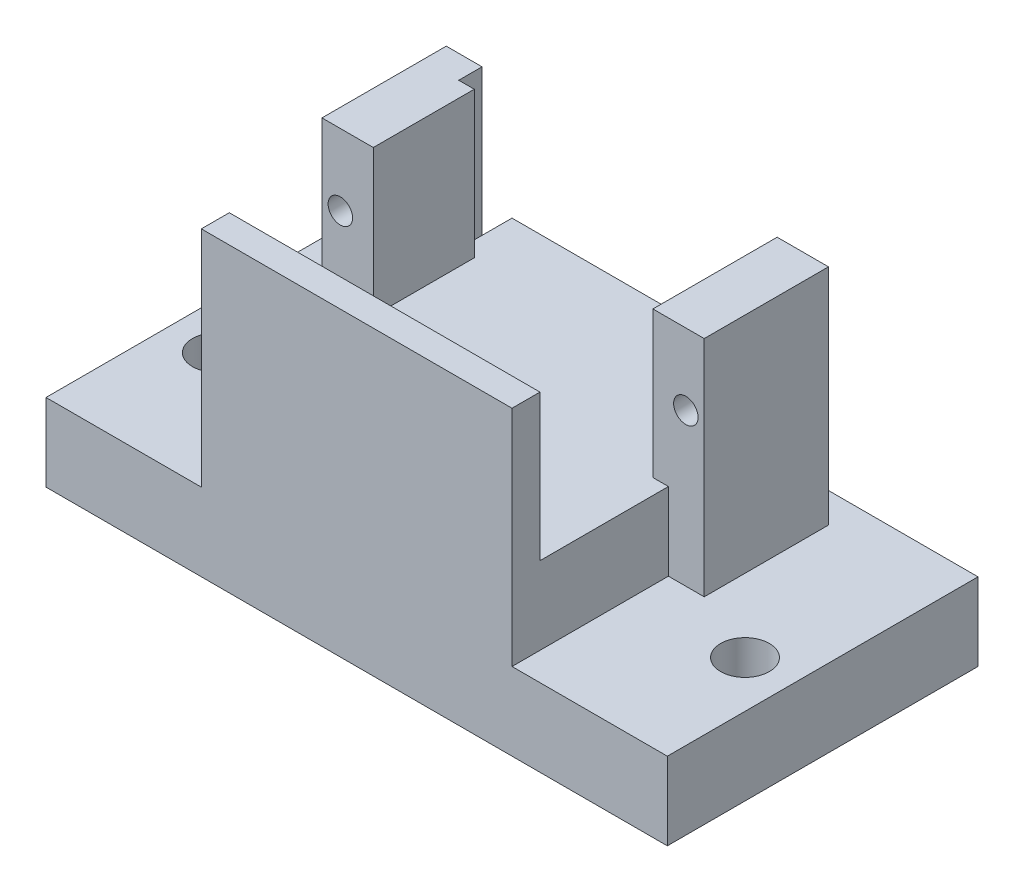
ISO-10303-21;
HEADER;
FILE_DESCRIPTION(('STEP AP214'),'2;1');
FILE_NAME('part.step','',(''),(''),'','','');
FILE_SCHEMA(('AUTOMOTIVE_DESIGN { 1 0 10303 214 1 1 1 1 }'));
ENDSEC;
DATA;
#1=APPLICATION_CONTEXT('core data for automotive mechanical design processes');
#2=APPLICATION_PROTOCOL_DEFINITION('international standard','automotive_design',2000,#1);
#3=PRODUCT_CONTEXT('',#1,'mechanical');
#4=PRODUCT('Part','Part','',(#3));
#5=PRODUCT_RELATED_PRODUCT_CATEGORY('part','',(#4));
#6=PRODUCT_DEFINITION_FORMATION('','',#4);
#7=PRODUCT_DEFINITION_CONTEXT('part definition',#1,'design');
#8=PRODUCT_DEFINITION('design','',#6,#7);
#9=PRODUCT_DEFINITION_SHAPE('','',#8);
#10=(LENGTH_UNIT() NAMED_UNIT(*) SI_UNIT(.MILLI.,.METRE.));
#11=(NAMED_UNIT(*) PLANE_ANGLE_UNIT() SI_UNIT($,.RADIAN.));
#12=(NAMED_UNIT(*) SI_UNIT($,.STERADIAN.) SOLID_ANGLE_UNIT());
#13=UNCERTAINTY_MEASURE_WITH_UNIT(LENGTH_MEASURE(1.E-05),#10,'distance_accuracy_value','');
#14=(GEOMETRIC_REPRESENTATION_CONTEXT(3) GLOBAL_UNCERTAINTY_ASSIGNED_CONTEXT((#13)) GLOBAL_UNIT_ASSIGNED_CONTEXT((#10,
#11,#12)) REPRESENTATION_CONTEXT('',''));
#15=CARTESIAN_POINT('',(0.,0.,0.));
#16=DIRECTION('',(0.,0.,1.));
#17=DIRECTION('',(1.,0.,0.));
#18=AXIS2_PLACEMENT_3D('',#15,#16,#17);
#19=CARTESIAN_POINT('',(0.,0.,0.));
#20=DIRECTION('',(0.,-1.,0.));
#21=DIRECTION('',(0.,0.,-1.));
#22=AXIS2_PLACEMENT_3D('',#19,#20,#21);
#23=PLANE('',#22);
#24=CARTESIAN_POINT('',(-21.59,0.,2.54));
#25=DIRECTION('',(0.,1.,0.));
#26=DIRECTION('',(0.,0.,1.));
#27=AXIS2_PLACEMENT_3D('',#24,#25,#26);
#28=CIRCLE('',#27,1.9939);
#29=CARTESIAN_POINT('',(-21.59,0.,4.5339));
#30=VERTEX_POINT('',#29);
#31=EDGE_CURVE('E553',#30,#30,#28,.F.);
#32=ORIENTED_EDGE('',*,*,#31,.F.);
#33=EDGE_LOOP('',(#32));
#34=FACE_BOUND('',#33,.T.);
#35=DIRECTION('',(-1.,0.,0.));
#36=VECTOR('',#35,1.);
#37=CARTESIAN_POINT('',(-12.7,0.,-12.7));
#38=LINE('',#37,#36);
#39=CARTESIAN_POINT('',(25.4,0.,-12.7));
#40=VERTEX_POINT('',#39);
#41=CARTESIAN_POINT('',(-25.4,0.,-12.7));
#42=VERTEX_POINT('',#41);
#43=EDGE_CURVE('E363',#40,#42,#38,.T.);
#44=ORIENTED_EDGE('',*,*,#43,.F.);
#45=DIRECTION('',(0.,0.,1.));
#46=VECTOR('',#45,1.);
#47=CARTESIAN_POINT('',(25.4,0.,-12.7));
#48=LINE('',#47,#46);
#49=CARTESIAN_POINT('',(25.4,0.,12.7));
#50=VERTEX_POINT('',#49);
#51=EDGE_CURVE('E335',#40,#50,#48,.T.);
#52=ORIENTED_EDGE('',*,*,#51,.T.);
#53=DIRECTION('',(1.,0.,0.));
#54=VECTOR('',#53,1.);
#55=CARTESIAN_POINT('',(-12.7,0.,12.7));
#56=LINE('',#55,#54);
#57=CARTESIAN_POINT('',(-25.4,0.,12.7));
#58=VERTEX_POINT('',#57);
#59=EDGE_CURVE('E372',#58,#50,#56,.T.);
#60=ORIENTED_EDGE('',*,*,#59,.F.);
#61=DIRECTION('',(0.,0.,1.));
#62=VECTOR('',#61,1.);
#63=CARTESIAN_POINT('',(-25.4,0.,-12.7));
#64=LINE('',#63,#62);
#65=EDGE_CURVE('E347',#42,#58,#64,.T.);
#66=ORIENTED_EDGE('',*,*,#65,.F.);
#67=EDGE_LOOP('',(#44,#52,#60,#66));
#68=FACE_BOUND('',#67,.T.);
#69=CARTESIAN_POINT('',(21.59,0.,2.54));
#70=DIRECTION('',(0.,1.,0.));
#71=DIRECTION('',(0.,0.,1.));
#72=AXIS2_PLACEMENT_3D('',#69,#70,#71);
#73=CIRCLE('',#72,1.9939);
#74=CARTESIAN_POINT('',(21.59,0.,4.5339));
#75=VERTEX_POINT('',#74);
#76=EDGE_CURVE('E230',#75,#75,#73,.T.);
#77=ORIENTED_EDGE('',*,*,#76,.T.);
#78=EDGE_LOOP('',(#77));
#79=FACE_BOUND('',#78,.T.);
#80=ADVANCED_FACE('F35',(#34,#68,#79),#23,.T.);
#81=CARTESIAN_POINT('',(-12.7,35.2106640446011,-10.25));
#82=DIRECTION('',(-1.,0.,0.));
#83=DIRECTION('',(0.,0.,1.));
#84=AXIS2_PLACEMENT_3D('',#81,#82,#83);
#85=PLANE('',#84);
#86=DIRECTION('',(0.,-1.,0.));
#87=VECTOR('',#86,1.);
#88=CARTESIAN_POINT('',(-12.7,34.8770673403392,-8.345));
#89=LINE('',#88,#87);
#90=CARTESIAN_POINT('',(-12.7,24.638,-8.345));
#91=VERTEX_POINT('',#90);
#92=CARTESIAN_POINT('',(-12.7,12.7,-8.345));
#93=VERTEX_POINT('',#92);
#94=EDGE_CURVE('E252',#91,#93,#89,.T.);
#95=ORIENTED_EDGE('',*,*,#94,.T.);
#96=DIRECTION('',(0.,0.,-1.));
#97=VECTOR('',#96,1.);
#98=CARTESIAN_POINT('',(-12.7,12.7,0.));
#99=LINE('',#98,#97);
#100=CARTESIAN_POINT('',(-12.7,12.7,-10.25));
#101=VERTEX_POINT('',#100);
#102=EDGE_CURVE('E308',#93,#101,#99,.T.);
#103=ORIENTED_EDGE('',*,*,#102,.T.);
#104=DIRECTION('',(0.,-1.,0.));
#105=VECTOR('',#104,1.);
#106=CARTESIAN_POINT('',(-12.7,35.2106640446011,-10.25));
#107=LINE('',#106,#105);
#108=CARTESIAN_POINT('',(-12.7,24.638,-10.25));
#109=VERTEX_POINT('',#108);
#110=EDGE_CURVE('E297',#109,#101,#107,.T.);
#111=ORIENTED_EDGE('',*,*,#110,.F.);
#112=DIRECTION('',(0.,0.,-1.));
#113=VECTOR('',#112,1.);
#114=CARTESIAN_POINT('',(-12.7,24.638,-10.25));
#115=LINE('',#114,#113);
#116=EDGE_CURVE('E306',#91,#109,#115,.T.);
#117=ORIENTED_EDGE('',*,*,#116,.F.);
#118=EDGE_LOOP('',(#95,#103,#111,#117));
#119=FACE_BOUND('',#118,.T.);
#120=ADVANCED_FACE('F432',(#119),#85,.F.);
#121=CARTESIAN_POINT('',(12.7,12.7,12.7));
#122=DIRECTION('',(-1.,0.,0.));
#123=DIRECTION('',(0.,0.,1.));
#124=AXIS2_PLACEMENT_3D('',#121,#122,#123);
#125=PLANE('',#124);
#126=DIRECTION('',(0.,-1.,0.));
#127=VECTOR('',#126,1.);
#128=CARTESIAN_POINT('',(12.7,35.2106640446011,-10.25));
#129=LINE('',#128,#127);
#130=CARTESIAN_POINT('',(12.7,12.7,-10.25));
#131=VERTEX_POINT('',#130);
#132=CARTESIAN_POINT('',(12.7,6.35,-10.25));
#133=VERTEX_POINT('',#132);
#134=EDGE_CURVE('E278',#131,#133,#129,.T.);
#135=ORIENTED_EDGE('',*,*,#134,.T.);
#136=DIRECTION('',(0.,0.,-1.));
#137=VECTOR('',#136,1.);
#138=CARTESIAN_POINT('',(12.7,6.35,-12.7));
#139=LINE('',#138,#137);
#140=CARTESIAN_POINT('',(12.7,6.35,-12.7));
#141=VERTEX_POINT('',#140);
#142=EDGE_CURVE('E325',#133,#141,#139,.T.);
#143=ORIENTED_EDGE('',*,*,#142,.T.);
#144=DIRECTION('',(0.,-1.,0.));
#145=VECTOR('',#144,1.);
#146=CARTESIAN_POINT('',(12.7,12.7,-12.7));
#147=LINE('',#146,#145);
#148=CARTESIAN_POINT('',(12.7,12.7,-12.7));
#149=VERTEX_POINT('',#148);
#150=EDGE_CURVE('E11',#149,#141,#147,.T.);
#151=ORIENTED_EDGE('',*,*,#150,.F.);
#152=DIRECTION('',(0.,0.,-1.));
#153=VECTOR('',#152,1.);
#154=CARTESIAN_POINT('',(12.7,12.7,12.7));
#155=LINE('',#154,#153);
#156=EDGE_CURVE('E367',#131,#149,#155,.T.);
#157=ORIENTED_EDGE('',*,*,#156,.F.);
#158=EDGE_LOOP('',(#135,#143,#151,#157));
#159=FACE_BOUND('',#158,.T.);
#160=ADVANCED_FACE('F37',(#159),#125,.F.);
#161=DIRECTION('',(0.,-1.,0.));
#162=VECTOR('',#161,1.);
#163=CARTESIAN_POINT('',(12.7,35.2106640446011,-0.0899999999999966));
#164=LINE('',#163,#162);
#165=CARTESIAN_POINT('',(12.7,12.7,-0.0899999999999966));
#166=VERTEX_POINT('',#165);
#167=CARTESIAN_POINT('',(12.7,6.35,-0.0899999999999966));
#168=VERTEX_POINT('',#167);
#169=EDGE_CURVE('E275',#166,#168,#164,.T.);
#170=ORIENTED_EDGE('',*,*,#169,.F.);
#171=CARTESIAN_POINT('',(12.7,12.7,10.414));
#172=VERTEX_POINT('',#171);
#173=EDGE_CURVE('E364',#172,#166,#155,.T.);
#174=ORIENTED_EDGE('',*,*,#173,.F.);
#175=DIRECTION('',(0.,-1.,0.));
#176=VECTOR('',#175,1.);
#177=CARTESIAN_POINT('',(12.7,50.1406625276656,10.414));
#178=LINE('',#177,#176);
#179=CARTESIAN_POINT('',(12.7,24.638,10.414));
#180=VERTEX_POINT('',#179);
#181=EDGE_CURVE('E215',#180,#172,#178,.T.);
#182=ORIENTED_EDGE('',*,*,#181,.F.);
#183=DIRECTION('',(0.,0.,-1.));
#184=VECTOR('',#183,1.);
#185=CARTESIAN_POINT('',(12.7,24.638,0.));
#186=LINE('',#185,#184);
#187=CARTESIAN_POINT('',(12.7,24.638,12.7));
#188=VERTEX_POINT('',#187);
#189=EDGE_CURVE('E211',#188,#180,#186,.T.);
#190=ORIENTED_EDGE('',*,*,#189,.F.);
#191=DIRECTION('',(0.,-1.,0.));
#192=VECTOR('',#191,1.);
#193=CARTESIAN_POINT('',(12.7,12.7,12.7));
#194=LINE('',#193,#192);
#195=CARTESIAN_POINT('',(12.7,6.35,12.7));
#196=VERTEX_POINT('',#195);
#197=EDGE_CURVE('E195',#188,#196,#194,.T.);
#198=ORIENTED_EDGE('',*,*,#197,.T.);
#199=EDGE_CURVE('E330',#196,#168,#139,.T.);
#200=ORIENTED_EDGE('',*,*,#199,.T.);
#201=EDGE_LOOP('',(#170,#174,#182,#190,#198,#200));
#202=FACE_BOUND('',#201,.T.);
#203=ADVANCED_FACE('F213',(#202),#125,.F.);
#204=CARTESIAN_POINT('',(25.4,6.35,-12.7));
#205=DIRECTION('',(0.,1.,0.));
#206=DIRECTION('',(0.,0.,1.));
#207=AXIS2_PLACEMENT_3D('',#204,#205,#206);
#208=PLANE('',#207);
#209=CARTESIAN_POINT('',(21.59,6.35,2.54));
#210=DIRECTION('',(0.,1.,0.));
#211=DIRECTION('',(0.,0.,1.));
#212=AXIS2_PLACEMENT_3D('',#209,#210,#211);
#213=CIRCLE('',#212,1.9939);
#214=CARTESIAN_POINT('',(21.59,6.35,4.5339));
#215=VERTEX_POINT('',#214);
#216=EDGE_CURVE('E561',#215,#215,#213,.T.);
#217=ORIENTED_EDGE('',*,*,#216,.F.);
#218=EDGE_LOOP('',(#217));
#219=FACE_BOUND('',#218,.T.);
#220=ORIENTED_EDGE('',*,*,#142,.F.);
#221=DIRECTION('',(-1.,0.,0.));
#222=VECTOR('',#221,1.);
#223=CARTESIAN_POINT('',(15.625,6.35,-10.25));
#224=LINE('',#223,#222);
#225=CARTESIAN_POINT('',(15.625,6.35,-10.25));
#226=VERTEX_POINT('',#225);
#227=EDGE_CURVE('E276',#226,#133,#224,.T.);
#228=ORIENTED_EDGE('',*,*,#227,.F.);
#229=DIRECTION('',(0.,0.,-1.));
#230=VECTOR('',#229,1.);
#231=CARTESIAN_POINT('',(15.625,6.35,-10.25));
#232=LINE('',#231,#230);
#233=CARTESIAN_POINT('',(15.625,6.35,-0.0899999999999963));
#234=VERTEX_POINT('',#233);
#235=EDGE_CURVE('E268',#234,#226,#232,.T.);
#236=ORIENTED_EDGE('',*,*,#235,.F.);
#237=DIRECTION('',(1.,0.,0.));
#238=VECTOR('',#237,1.);
#239=CARTESIAN_POINT('',(15.625,6.35,-0.0899999999999966));
#240=LINE('',#239,#238);
#241=EDGE_CURVE('E273',#168,#234,#240,.T.);
#242=ORIENTED_EDGE('',*,*,#241,.F.);
#243=ORIENTED_EDGE('',*,*,#199,.F.);
#244=DIRECTION('',(-1.,0.,0.));
#245=VECTOR('',#244,1.);
#246=CARTESIAN_POINT('',(25.4,6.35,12.7));
#247=LINE('',#246,#245);
#248=CARTESIAN_POINT('',(25.4,6.35,12.7));
#249=VERTEX_POINT('',#248);
#250=EDGE_CURVE('E203',#249,#196,#247,.T.);
#251=ORIENTED_EDGE('',*,*,#250,.F.);
#252=DIRECTION('',(0.,0.,-1.));
#253=VECTOR('',#252,1.);
#254=CARTESIAN_POINT('',(25.4,6.35,-12.7));
#255=LINE('',#254,#253);
#256=CARTESIAN_POINT('',(25.4,6.35,-12.7));
#257=VERTEX_POINT('',#256);
#258=EDGE_CURVE('E329',#249,#257,#255,.T.);
#259=ORIENTED_EDGE('',*,*,#258,.T.);
#260=DIRECTION('',(-1.,0.,0.));
#261=VECTOR('',#260,1.);
#262=CARTESIAN_POINT('',(25.4,6.35,-12.7));
#263=LINE('',#262,#261);
#264=EDGE_CURVE('E340',#257,#141,#263,.T.);
#265=ORIENTED_EDGE('',*,*,#264,.T.);
#266=EDGE_LOOP('',(#220,#228,#236,#242,#243,#251,#259,#265));
#267=FACE_BOUND('',#266,.T.);
#268=ADVANCED_FACE('F406',(#219,#267),#208,.T.);
#269=CARTESIAN_POINT('',(-12.7,12.7,12.7));
#270=DIRECTION('',(1.,0.,0.));
#271=DIRECTION('',(0.,0.,-1.));
#272=AXIS2_PLACEMENT_3D('',#269,#270,#271);
#273=PLANE('',#272);
#274=DIRECTION('',(0.,-1.,0.));
#275=VECTOR('',#274,1.);
#276=CARTESIAN_POINT('',(-12.7,35.2106640446011,-0.0899999999999966));
#277=LINE('',#276,#275);
#278=CARTESIAN_POINT('',(-12.7,12.7,-0.0899999999999963));
#279=VERTEX_POINT('',#278);
#280=CARTESIAN_POINT('',(-12.7,6.35,-0.0899999999999963));
#281=VERTEX_POINT('',#280);
#282=EDGE_CURVE('E301',#279,#281,#277,.T.);
#283=ORIENTED_EDGE('',*,*,#282,.T.);
#284=DIRECTION('',(0.,0.,-1.));
#285=VECTOR('',#284,1.);
#286=CARTESIAN_POINT('',(-12.7,6.35,-12.7));
#287=LINE('',#286,#285);
#288=CARTESIAN_POINT('',(-12.7,6.35,12.7));
#289=VERTEX_POINT('',#288);
#290=EDGE_CURVE('E348',#289,#281,#287,.T.);
#291=ORIENTED_EDGE('',*,*,#290,.F.);
#292=DIRECTION('',(0.,-1.,0.));
#293=VECTOR('',#292,1.);
#294=CARTESIAN_POINT('',(-12.7,12.7,12.7));
#295=LINE('',#294,#293);
#296=CARTESIAN_POINT('',(-12.7,24.638,12.7));
#297=VERTEX_POINT('',#296);
#298=EDGE_CURVE('E207',#297,#289,#295,.T.);
#299=ORIENTED_EDGE('',*,*,#298,.F.);
#300=DIRECTION('',(0.,0.,1.));
#301=VECTOR('',#300,1.);
#302=CARTESIAN_POINT('',(-12.7,24.638,0.));
#303=LINE('',#302,#301);
#304=CARTESIAN_POINT('',(-12.7,24.638,10.414));
#305=VERTEX_POINT('',#304);
#306=EDGE_CURVE('E222',#305,#297,#303,.T.);
#307=ORIENTED_EDGE('',*,*,#306,.F.);
#308=DIRECTION('',(0.,-1.,0.));
#309=VECTOR('',#308,1.);
#310=CARTESIAN_POINT('',(-12.7,50.1406625276656,10.414));
#311=LINE('',#310,#309);
#312=CARTESIAN_POINT('',(-12.7,12.7,10.414));
#313=VERTEX_POINT('',#312);
#314=EDGE_CURVE('E232',#305,#313,#311,.T.);
#315=ORIENTED_EDGE('',*,*,#314,.T.);
#316=DIRECTION('',(0.,0.,1.));
#317=VECTOR('',#316,1.);
#318=CARTESIAN_POINT('',(-12.7,12.7,12.7));
#319=LINE('',#318,#317);
#320=EDGE_CURVE('E51',#279,#313,#319,.T.);
#321=ORIENTED_EDGE('',*,*,#320,.F.);
#322=EDGE_LOOP('',(#283,#291,#299,#307,#315,#321));
#323=FACE_BOUND('',#322,.T.);
#324=ADVANCED_FACE('F465',(#323),#273,.F.);
#325=CARTESIAN_POINT('',(-12.7,6.35,-10.25));
#326=VERTEX_POINT('',#325);
#327=EDGE_CURVE('E319',#101,#326,#107,.T.);
#328=ORIENTED_EDGE('',*,*,#327,.F.);
#329=CARTESIAN_POINT('',(-12.7,12.7,-12.7));
#330=VERTEX_POINT('',#329);
#331=EDGE_CURVE('E208',#330,#101,#319,.T.);
#332=ORIENTED_EDGE('',*,*,#331,.F.);
#333=DIRECTION('',(0.,-1.,0.));
#334=VECTOR('',#333,1.);
#335=CARTESIAN_POINT('',(-12.7,12.7,-12.7));
#336=LINE('',#335,#334);
#337=CARTESIAN_POINT('',(-12.7,6.35,-12.7));
#338=VERTEX_POINT('',#337);
#339=EDGE_CURVE('E44',#330,#338,#336,.T.);
#340=ORIENTED_EDGE('',*,*,#339,.T.);
#341=EDGE_CURVE('E343',#326,#338,#287,.T.);
#342=ORIENTED_EDGE('',*,*,#341,.F.);
#343=EDGE_LOOP('',(#328,#332,#340,#342));
#344=FACE_BOUND('',#343,.T.);
#345=ADVANCED_FACE('F381',(#344),#273,.F.);
#346=CARTESIAN_POINT('',(-25.4,6.35,-12.7));
#347=DIRECTION('',(0.,-1.,0.));
#348=DIRECTION('',(0.,0.,-1.));
#349=AXIS2_PLACEMENT_3D('',#346,#347,#348);
#350=PLANE('',#349);
#351=CARTESIAN_POINT('',(-21.59,6.35,2.54));
#352=DIRECTION('',(0.,1.,0.));
#353=DIRECTION('',(0.,0.,1.));
#354=AXIS2_PLACEMENT_3D('',#351,#352,#353);
#355=CIRCLE('',#354,1.9939);
#356=CARTESIAN_POINT('',(-21.59,6.35,4.5339));
#357=VERTEX_POINT('',#356);
#358=EDGE_CURVE('E551',#357,#357,#355,.F.);
#359=ORIENTED_EDGE('',*,*,#358,.T.);
#360=EDGE_LOOP('',(#359));
#361=FACE_BOUND('',#360,.T.);
#362=DIRECTION('',(1.,0.,0.));
#363=VECTOR('',#362,1.);
#364=CARTESIAN_POINT('',(-15.625,6.35,-0.0899999999999966));
#365=LINE('',#364,#363);
#366=CARTESIAN_POINT('',(-15.625,6.35,-0.0899999999999963));
#367=VERTEX_POINT('',#366);
#368=EDGE_CURVE('E298',#367,#281,#365,.T.);
#369=ORIENTED_EDGE('',*,*,#368,.F.);
#370=DIRECTION('',(0.,0.,1.));
#371=VECTOR('',#370,1.);
#372=CARTESIAN_POINT('',(-15.625,6.35,-10.25));
#373=LINE('',#372,#371);
#374=CARTESIAN_POINT('',(-15.625,6.35,-10.25));
#375=VERTEX_POINT('',#374);
#376=EDGE_CURVE('E303',#375,#367,#373,.T.);
#377=ORIENTED_EDGE('',*,*,#376,.F.);
#378=DIRECTION('',(-1.,0.,0.));
#379=VECTOR('',#378,1.);
#380=CARTESIAN_POINT('',(-15.625,6.35,-10.25));
#381=LINE('',#380,#379);
#382=EDGE_CURVE('E293',#326,#375,#381,.T.);
#383=ORIENTED_EDGE('',*,*,#382,.F.);
#384=ORIENTED_EDGE('',*,*,#341,.T.);
#385=DIRECTION('',(1.,0.,0.));
#386=VECTOR('',#385,1.);
#387=CARTESIAN_POINT('',(-25.4,6.35,-12.7));
#388=LINE('',#387,#386);
#389=CARTESIAN_POINT('',(-25.4,6.35,-12.7));
#390=VERTEX_POINT('',#389);
#391=EDGE_CURVE('E355',#390,#338,#388,.T.);
#392=ORIENTED_EDGE('',*,*,#391,.F.);
#393=DIRECTION('',(0.,0.,-1.));
#394=VECTOR('',#393,1.);
#395=CARTESIAN_POINT('',(-25.4,6.35,-12.7));
#396=LINE('',#395,#394);
#397=CARTESIAN_POINT('',(-25.4,6.35,12.7));
#398=VERTEX_POINT('',#397);
#399=EDGE_CURVE('E353',#398,#390,#396,.T.);
#400=ORIENTED_EDGE('',*,*,#399,.F.);
#401=DIRECTION('',(1.,0.,0.));
#402=VECTOR('',#401,1.);
#403=CARTESIAN_POINT('',(-25.4,6.35,12.7));
#404=LINE('',#403,#402);
#405=EDGE_CURVE('E360',#398,#289,#404,.T.);
#406=ORIENTED_EDGE('',*,*,#405,.T.);
#407=ORIENTED_EDGE('',*,*,#290,.T.);
#408=EDGE_LOOP('',(#369,#377,#383,#384,#392,#400,#406,#407));
#409=FACE_BOUND('',#408,.T.);
#410=ADVANCED_FACE('F390',(#361,#409),#350,.F.);
#411=CARTESIAN_POINT('',(-12.7,12.7,-12.7));
#412=DIRECTION('',(0.,0.,1.));
#413=DIRECTION('',(1.,0.,0.));
#414=AXIS2_PLACEMENT_3D('',#411,#412,#413);
#415=PLANE('',#414);
#416=ORIENTED_EDGE('',*,*,#43,.T.);
#417=DIRECTION('',(0.,-1.,0.));
#418=VECTOR('',#417,1.);
#419=CARTESIAN_POINT('',(-25.4,6.35,-12.7));
#420=LINE('',#419,#418);
#421=EDGE_CURVE('E344',#390,#42,#420,.T.);
#422=ORIENTED_EDGE('',*,*,#421,.F.);
#423=ORIENTED_EDGE('',*,*,#391,.T.);
#424=ORIENTED_EDGE('',*,*,#339,.F.);
#425=DIRECTION('',(-1.,0.,0.));
#426=VECTOR('',#425,1.);
#427=CARTESIAN_POINT('',(-12.7,12.7,-12.7));
#428=LINE('',#427,#426);
#429=EDGE_CURVE('E366',#149,#330,#428,.T.);
#430=ORIENTED_EDGE('',*,*,#429,.F.);
#431=ORIENTED_EDGE('',*,*,#150,.T.);
#432=ORIENTED_EDGE('',*,*,#264,.F.);
#433=DIRECTION('',(0.,-1.,0.));
#434=VECTOR('',#433,1.);
#435=CARTESIAN_POINT('',(25.4,6.35,-12.7));
#436=LINE('',#435,#434);
#437=EDGE_CURVE('E326',#257,#40,#436,.T.);
#438=ORIENTED_EDGE('',*,*,#437,.T.);
#439=EDGE_LOOP('',(#416,#422,#423,#424,#430,#431,#432,#438));
#440=FACE_BOUND('',#439,.T.);
#441=ADVANCED_FACE('F387',(#440),#415,.F.);
#442=CARTESIAN_POINT('',(-12.7,12.7,12.7));
#443=DIRECTION('',(0.,0.,-1.));
#444=DIRECTION('',(-1.,0.,0.));
#445=AXIS2_PLACEMENT_3D('',#442,#443,#444);
#446=PLANE('',#445);
#447=ORIENTED_EDGE('',*,*,#59,.T.);
#448=DIRECTION('',(0.,1.,0.));
#449=VECTOR('',#448,1.);
#450=CARTESIAN_POINT('',(25.4,0.,12.7));
#451=LINE('',#450,#449);
#452=EDGE_CURVE('E333',#50,#249,#451,.T.);
#453=ORIENTED_EDGE('',*,*,#452,.T.);
#454=ORIENTED_EDGE('',*,*,#250,.T.);
#455=ORIENTED_EDGE('',*,*,#197,.F.);
#456=DIRECTION('',(1.,0.,0.));
#457=VECTOR('',#456,1.);
#458=CARTESIAN_POINT('',(0.,24.638,12.7));
#459=LINE('',#458,#457);
#460=EDGE_CURVE('E200',#297,#188,#459,.T.);
#461=ORIENTED_EDGE('',*,*,#460,.F.);
#462=ORIENTED_EDGE('',*,*,#298,.T.);
#463=ORIENTED_EDGE('',*,*,#405,.F.);
#464=DIRECTION('',(0.,1.,0.));
#465=VECTOR('',#464,1.);
#466=CARTESIAN_POINT('',(-25.4,0.,12.7));
#467=LINE('',#466,#465);
#468=EDGE_CURVE('E351',#58,#398,#467,.T.);
#469=ORIENTED_EDGE('',*,*,#468,.F.);
#470=EDGE_LOOP('',(#447,#453,#454,#455,#461,#462,#463,#469));
#471=FACE_BOUND('',#470,.T.);
#472=ADVANCED_FACE('F197',(#471),#446,.F.);
#473=CARTESIAN_POINT('',(0.,12.7,0.));
#474=DIRECTION('',(0.,-1.,0.));
#475=DIRECTION('',(0.,0.,-1.));
#476=AXIS2_PLACEMENT_3D('',#473,#474,#475);
#477=PLANE('',#476);
#478=ORIENTED_EDGE('',*,*,#320,.T.);
#479=DIRECTION('',(1.,0.,0.));
#480=VECTOR('',#479,1.);
#481=CARTESIAN_POINT('',(0.,12.7,10.414));
#482=LINE('',#481,#480);
#483=EDGE_CURVE('E224',#313,#172,#482,.T.);
#484=ORIENTED_EDGE('',*,*,#483,.T.);
#485=ORIENTED_EDGE('',*,*,#173,.T.);
#486=DIRECTION('',(1.,0.,0.));
#487=VECTOR('',#486,1.);
#488=CARTESIAN_POINT('',(0.,12.7,-0.0899999999999966));
#489=LINE('',#488,#487);
#490=CARTESIAN_POINT('',(11.43,12.7,-0.0899999999999966));
#491=VERTEX_POINT('',#490);
#492=EDGE_CURVE('E238',#491,#166,#489,.T.);
#493=ORIENTED_EDGE('',*,*,#492,.F.);
#494=DIRECTION('',(0.,0.,1.));
#495=VECTOR('',#494,1.);
#496=CARTESIAN_POINT('',(11.43,12.7,0.));
#497=LINE('',#496,#495);
#498=CARTESIAN_POINT('',(11.43,12.7,-10.25));
#499=VERTEX_POINT('',#498);
#500=EDGE_CURVE('E242',#499,#491,#497,.T.);
#501=ORIENTED_EDGE('',*,*,#500,.F.);
#502=DIRECTION('',(1.,0.,0.));
#503=VECTOR('',#502,1.);
#504=CARTESIAN_POINT('',(0.,12.7,-10.25));
#505=LINE('',#504,#503);
#506=EDGE_CURVE('E235',#499,#131,#505,.T.);
#507=ORIENTED_EDGE('',*,*,#506,.T.);
#508=ORIENTED_EDGE('',*,*,#156,.T.);
#509=ORIENTED_EDGE('',*,*,#429,.T.);
#510=ORIENTED_EDGE('',*,*,#331,.T.);
#511=ORIENTED_EDGE('',*,*,#102,.F.);
#512=DIRECTION('',(-1.,0.,0.));
#513=VECTOR('',#512,1.);
#514=CARTESIAN_POINT('',(0.,12.7,-8.345));
#515=LINE('',#514,#513);
#516=CARTESIAN_POINT('',(-11.43,12.7,-8.345));
#517=VERTEX_POINT('',#516);
#518=EDGE_CURVE('E250',#517,#93,#515,.T.);
#519=ORIENTED_EDGE('',*,*,#518,.F.);
#520=DIRECTION('',(0.,0.,1.));
#521=VECTOR('',#520,1.);
#522=CARTESIAN_POINT('',(-11.43,12.7,0.));
#523=LINE('',#522,#521);
#524=CARTESIAN_POINT('',(-11.43,12.7,-0.0899999999999966));
#525=VERTEX_POINT('',#524);
#526=EDGE_CURVE('E254',#517,#525,#523,.T.);
#527=ORIENTED_EDGE('',*,*,#526,.T.);
#528=DIRECTION('',(-1.,0.,0.));
#529=VECTOR('',#528,1.);
#530=CARTESIAN_POINT('',(0.,12.7,-0.0899999999999985));
#531=LINE('',#530,#529);
#532=EDGE_CURVE('E257',#525,#279,#531,.T.);
#533=ORIENTED_EDGE('',*,*,#532,.T.);
#534=EDGE_LOOP('',(#478,#484,#485,#493,#501,#507,#508,#509,#510,#511,#519,#527,#533));
#535=FACE_BOUND('',#534,.T.);
#536=ADVANCED_FACE('F397',(#535),#477,.F.);
#537=CARTESIAN_POINT('',(-25.4,0.,0.));
#538=DIRECTION('',(-1.,0.,0.));
#539=DIRECTION('',(0.,0.,1.));
#540=AXIS2_PLACEMENT_3D('',#537,#538,#539);
#541=PLANE('',#540);
#542=ORIENTED_EDGE('',*,*,#421,.T.);
#543=ORIENTED_EDGE('',*,*,#65,.T.);
#544=ORIENTED_EDGE('',*,*,#468,.T.);
#545=ORIENTED_EDGE('',*,*,#399,.T.);
#546=EDGE_LOOP('',(#542,#543,#544,#545));
#547=FACE_BOUND('',#546,.T.);
#548=ADVANCED_FACE('F418',(#547),#541,.T.);
#549=CARTESIAN_POINT('',(25.4,0.,0.));
#550=DIRECTION('',(1.,0.,0.));
#551=DIRECTION('',(0.,0.,1.));
#552=AXIS2_PLACEMENT_3D('',#549,#550,#551);
#553=PLANE('',#552);
#554=ORIENTED_EDGE('',*,*,#437,.F.);
#555=ORIENTED_EDGE('',*,*,#258,.F.);
#556=ORIENTED_EDGE('',*,*,#452,.F.);
#557=ORIENTED_EDGE('',*,*,#51,.F.);
#558=EDGE_LOOP('',(#554,#555,#556,#557));
#559=FACE_BOUND('',#558,.T.);
#560=ADVANCED_FACE('F411',(#559),#553,.T.);
#561=CARTESIAN_POINT('',(-15.625,35.2106640446011,-10.25));
#562=DIRECTION('',(1.,0.,0.));
#563=DIRECTION('',(0.,0.,-1.));
#564=AXIS2_PLACEMENT_3D('',#561,#562,#563);
#565=PLANE('',#564);
#566=DIRECTION('',(0.,0.,1.));
#567=VECTOR('',#566,1.);
#568=CARTESIAN_POINT('',(-15.625,24.638,-10.25));
#569=LINE('',#568,#567);
#570=CARTESIAN_POINT('',(-15.625,24.638,-10.25));
#571=VERTEX_POINT('',#570);
#572=CARTESIAN_POINT('',(-15.625,24.638,-0.0899999999999966));
#573=VERTEX_POINT('',#572);
#574=EDGE_CURVE('E311',#571,#573,#569,.T.);
#575=ORIENTED_EDGE('',*,*,#574,.F.);
#576=DIRECTION('',(0.,-1.,0.));
#577=VECTOR('',#576,1.);
#578=CARTESIAN_POINT('',(-15.625,35.2106640446011,-10.25));
#579=LINE('',#578,#577);
#580=EDGE_CURVE('E282',#571,#375,#579,.T.);
#581=ORIENTED_EDGE('',*,*,#580,.T.);
#582=ORIENTED_EDGE('',*,*,#376,.T.);
#583=DIRECTION('',(0.,-1.,0.));
#584=VECTOR('',#583,1.);
#585=CARTESIAN_POINT('',(-15.625,35.2106640446011,-0.0899999999999966));
#586=LINE('',#585,#584);
#587=EDGE_CURVE('E302',#573,#367,#586,.T.);
#588=ORIENTED_EDGE('',*,*,#587,.F.);
#589=EDGE_LOOP('',(#575,#581,#582,#588));
#590=FACE_BOUND('',#589,.T.);
#591=ADVANCED_FACE('F428',(#590),#565,.F.);
#592=CARTESIAN_POINT('',(-15.625,35.2106640446011,-0.0899999999999966));
#593=DIRECTION('',(0.,0.,-1.));
#594=DIRECTION('',(-1.,0.,0.));
#595=AXIS2_PLACEMENT_3D('',#592,#593,#594);
#596=PLANE('',#595);
#597=CARTESIAN_POINT('',(-14.125,18.8,-0.0899999999999963));
#598=DIRECTION('',(0.,0.,-1.));
#599=DIRECTION('',(-1.,0.,0.));
#600=AXIS2_PLACEMENT_3D('',#597,#598,#599);
#601=CIRCLE('',#600,1.);
#602=CARTESIAN_POINT('',(-15.125,18.8,-0.0899999999999963));
#603=VERTEX_POINT('',#602);
#604=EDGE_CURVE('E550',#603,#603,#601,.T.);
#605=ORIENTED_EDGE('',*,*,#604,.T.);
#606=EDGE_LOOP('',(#605));
#607=FACE_BOUND('',#606,.T.);
#608=DIRECTION('',(1.,0.,0.));
#609=VECTOR('',#608,1.);
#610=CARTESIAN_POINT('',(-15.625,24.638,-0.0899999999999966));
#611=LINE('',#610,#609);
#612=CARTESIAN_POINT('',(-11.43,24.638,-0.0899999999999966));
#613=VERTEX_POINT('',#612);
#614=EDGE_CURVE('E309',#573,#613,#611,.T.);
#615=ORIENTED_EDGE('',*,*,#614,.F.);
#616=ORIENTED_EDGE('',*,*,#587,.T.);
#617=ORIENTED_EDGE('',*,*,#368,.T.);
#618=ORIENTED_EDGE('',*,*,#282,.F.);
#619=ORIENTED_EDGE('',*,*,#532,.F.);
#620=DIRECTION('',(0.,-1.,0.));
#621=VECTOR('',#620,1.);
#622=CARTESIAN_POINT('',(-11.43,34.8770673403392,-0.0899999999999966));
#623=LINE('',#622,#621);
#624=EDGE_CURVE('E263',#613,#525,#623,.T.);
#625=ORIENTED_EDGE('',*,*,#624,.F.);
#626=EDGE_LOOP('',(#615,#616,#617,#618,#619,#625));
#627=FACE_BOUND('',#626,.T.);
#628=ADVANCED_FACE('F423',(#607,#627),#596,.F.);
#629=CARTESIAN_POINT('',(-15.625,35.2106640446011,-10.25));
#630=DIRECTION('',(0.,0.,1.));
#631=DIRECTION('',(1.,0.,0.));
#632=AXIS2_PLACEMENT_3D('',#629,#630,#631);
#633=PLANE('',#632);
#634=CARTESIAN_POINT('',(-14.125,18.8,-10.25));
#635=DIRECTION('',(0.,0.,-1.));
#636=DIRECTION('',(-1.,0.,0.));
#637=AXIS2_PLACEMENT_3D('',#634,#635,#636);
#638=CIRCLE('',#637,1.);
#639=CARTESIAN_POINT('',(-15.125,18.8,-10.25));
#640=VERTEX_POINT('',#639);
#641=EDGE_CURVE('E547',#640,#640,#638,.T.);
#642=ORIENTED_EDGE('',*,*,#641,.F.);
#643=EDGE_LOOP('',(#642));
#644=FACE_BOUND('',#643,.T.);
#645=DIRECTION('',(-1.,0.,0.));
#646=VECTOR('',#645,1.);
#647=CARTESIAN_POINT('',(-15.625,24.638,-10.25));
#648=LINE('',#647,#646);
#649=EDGE_CURVE('E296',#109,#571,#648,.T.);
#650=ORIENTED_EDGE('',*,*,#649,.F.);
#651=ORIENTED_EDGE('',*,*,#110,.T.);
#652=ORIENTED_EDGE('',*,*,#327,.T.);
#653=ORIENTED_EDGE('',*,*,#382,.T.);
#654=ORIENTED_EDGE('',*,*,#580,.F.);
#655=EDGE_LOOP('',(#650,#651,#652,#653,#654));
#656=FACE_BOUND('',#655,.T.);
#657=ADVANCED_FACE('F393',(#644,#656),#633,.F.);
#658=CARTESIAN_POINT('',(0.,24.638,0.));
#659=DIRECTION('',(0.,1.,0.));
#660=DIRECTION('',(0.,0.,1.));
#661=AXIS2_PLACEMENT_3D('',#658,#659,#660);
#662=PLANE('',#661);
#663=ORIENTED_EDGE('',*,*,#649,.T.);
#664=ORIENTED_EDGE('',*,*,#574,.T.);
#665=ORIENTED_EDGE('',*,*,#614,.T.);
#666=DIRECTION('',(0.,0.,1.));
#667=VECTOR('',#666,1.);
#668=CARTESIAN_POINT('',(-11.43,24.638,0.));
#669=LINE('',#668,#667);
#670=CARTESIAN_POINT('',(-11.43,24.638,-8.345));
#671=VERTEX_POINT('',#670);
#672=EDGE_CURVE('E245',#671,#613,#669,.T.);
#673=ORIENTED_EDGE('',*,*,#672,.F.);
#674=DIRECTION('',(-1.,0.,0.));
#675=VECTOR('',#674,1.);
#676=CARTESIAN_POINT('',(0.,24.638,-8.345));
#677=LINE('',#676,#675);
#678=EDGE_CURVE('E59',#671,#91,#677,.T.);
#679=ORIENTED_EDGE('',*,*,#678,.T.);
#680=ORIENTED_EDGE('',*,*,#116,.T.);
#681=EDGE_LOOP('',(#663,#664,#665,#673,#679,#680));
#682=FACE_BOUND('',#681,.T.);
#683=ADVANCED_FACE('F429',(#682),#662,.T.);
#684=CARTESIAN_POINT('',(15.625,35.2106640446011,-10.25));
#685=DIRECTION('',(0.,0.,1.));
#686=DIRECTION('',(1.,0.,0.));
#687=AXIS2_PLACEMENT_3D('',#684,#685,#686);
#688=PLANE('',#687);
#689=CARTESIAN_POINT('',(14.125,18.8,-10.25));
#690=DIRECTION('',(0.,0.,-1.));
#691=DIRECTION('',(-1.,0.,0.));
#692=AXIS2_PLACEMENT_3D('',#689,#690,#691);
#693=CIRCLE('',#692,1.);
#694=CARTESIAN_POINT('',(13.125,18.8,-10.25));
#695=VERTEX_POINT('',#694);
#696=EDGE_CURVE('E557',#695,#695,#693,.T.);
#697=ORIENTED_EDGE('',*,*,#696,.F.);
#698=EDGE_LOOP('',(#697));
#699=FACE_BOUND('',#698,.T.);
#700=DIRECTION('',(-1.,0.,0.));
#701=VECTOR('',#700,1.);
#702=CARTESIAN_POINT('',(15.625,24.638,-10.25));
#703=LINE('',#702,#701);
#704=CARTESIAN_POINT('',(15.625,24.638,-10.25));
#705=VERTEX_POINT('',#704);
#706=CARTESIAN_POINT('',(11.43,24.638,-10.25));
#707=VERTEX_POINT('',#706);
#708=EDGE_CURVE('E283',#705,#707,#703,.T.);
#709=ORIENTED_EDGE('',*,*,#708,.F.);
#710=DIRECTION('',(0.,-1.,0.));
#711=VECTOR('',#710,1.);
#712=CARTESIAN_POINT('',(15.625,35.2106640446011,-10.25));
#713=LINE('',#712,#711);
#714=EDGE_CURVE('E260',#705,#226,#713,.T.);
#715=ORIENTED_EDGE('',*,*,#714,.T.);
#716=ORIENTED_EDGE('',*,*,#227,.T.);
#717=ORIENTED_EDGE('',*,*,#134,.F.);
#718=ORIENTED_EDGE('',*,*,#506,.F.);
#719=DIRECTION('',(0.,-1.,0.));
#720=VECTOR('',#719,1.);
#721=CARTESIAN_POINT('',(11.43,34.8770673403392,-10.25));
#722=LINE('',#721,#720);
#723=EDGE_CURVE('E241',#707,#499,#722,.T.);
#724=ORIENTED_EDGE('',*,*,#723,.F.);
#725=EDGE_LOOP('',(#709,#715,#716,#717,#718,#724));
#726=FACE_BOUND('',#725,.T.);
#727=ADVANCED_FACE('F486',(#699,#726),#688,.F.);
#728=CARTESIAN_POINT('',(15.625,35.2106640446011,-0.0899999999999966));
#729=DIRECTION('',(0.,0.,-1.));
#730=DIRECTION('',(-1.,0.,0.));
#731=AXIS2_PLACEMENT_3D('',#728,#729,#730);
#732=PLANE('',#731);
#733=CARTESIAN_POINT('',(14.125,18.8,-0.0899999999999963));
#734=DIRECTION('',(0.,0.,-1.));
#735=DIRECTION('',(-1.,0.,0.));
#736=AXIS2_PLACEMENT_3D('',#733,#734,#735);
#737=CIRCLE('',#736,1.);
#738=CARTESIAN_POINT('',(13.125,18.8,-0.0899999999999963));
#739=VERTEX_POINT('',#738);
#740=EDGE_CURVE('E39',#739,#739,#737,.T.);
#741=ORIENTED_EDGE('',*,*,#740,.T.);
#742=EDGE_LOOP('',(#741));
#743=FACE_BOUND('',#742,.T.);
#744=DIRECTION('',(1.,0.,0.));
#745=VECTOR('',#744,1.);
#746=CARTESIAN_POINT('',(15.625,24.638,-0.0899999999999966));
#747=LINE('',#746,#745);
#748=CARTESIAN_POINT('',(11.43,24.638,-0.0899999999999966));
#749=VERTEX_POINT('',#748);
#750=CARTESIAN_POINT('',(15.625,24.638,-0.0899999999999966));
#751=VERTEX_POINT('',#750);
#752=EDGE_CURVE('E279',#749,#751,#747,.T.);
#753=ORIENTED_EDGE('',*,*,#752,.F.);
#754=DIRECTION('',(0.,-1.,0.));
#755=VECTOR('',#754,1.);
#756=CARTESIAN_POINT('',(11.43,34.8770673403392,-0.0899999999999966));
#757=LINE('',#756,#755);
#758=EDGE_CURVE('E237',#749,#491,#757,.T.);
#759=ORIENTED_EDGE('',*,*,#758,.T.);
#760=ORIENTED_EDGE('',*,*,#492,.T.);
#761=ORIENTED_EDGE('',*,*,#169,.T.);
#762=ORIENTED_EDGE('',*,*,#241,.T.);
#763=DIRECTION('',(0.,-1.,0.));
#764=VECTOR('',#763,1.);
#765=CARTESIAN_POINT('',(15.625,35.2106640446011,-0.0899999999999966));
#766=LINE('',#765,#764);
#767=EDGE_CURVE('E272',#751,#234,#766,.T.);
#768=ORIENTED_EDGE('',*,*,#767,.F.);
#769=EDGE_LOOP('',(#753,#759,#760,#761,#762,#768));
#770=FACE_BOUND('',#769,.T.);
#771=ADVANCED_FACE('F497',(#743,#770),#732,.F.);
#772=CARTESIAN_POINT('',(15.625,35.2106640446011,-10.25));
#773=DIRECTION('',(-1.,0.,0.));
#774=DIRECTION('',(0.,0.,1.));
#775=AXIS2_PLACEMENT_3D('',#772,#773,#774);
#776=PLANE('',#775);
#777=DIRECTION('',(0.,0.,-1.));
#778=VECTOR('',#777,1.);
#779=CARTESIAN_POINT('',(15.625,24.638,-10.25));
#780=LINE('',#779,#778);
#781=EDGE_CURVE('E271',#751,#705,#780,.T.);
#782=ORIENTED_EDGE('',*,*,#781,.F.);
#783=ORIENTED_EDGE('',*,*,#767,.T.);
#784=ORIENTED_EDGE('',*,*,#235,.T.);
#785=ORIENTED_EDGE('',*,*,#714,.F.);
#786=EDGE_LOOP('',(#782,#783,#784,#785));
#787=FACE_BOUND('',#786,.T.);
#788=ADVANCED_FACE('F448',(#787),#776,.F.);
#789=CARTESIAN_POINT('',(0.,24.638,0.));
#790=DIRECTION('',(0.,1.,0.));
#791=DIRECTION('',(0.,0.,1.));
#792=AXIS2_PLACEMENT_3D('',#789,#790,#791);
#793=PLANE('',#792);
#794=ORIENTED_EDGE('',*,*,#781,.T.);
#795=ORIENTED_EDGE('',*,*,#708,.T.);
#796=DIRECTION('',(0.,0.,1.));
#797=VECTOR('',#796,1.);
#798=CARTESIAN_POINT('',(11.43,24.638,0.));
#799=LINE('',#798,#797);
#800=EDGE_CURVE('E219',#707,#749,#799,.T.);
#801=ORIENTED_EDGE('',*,*,#800,.T.);
#802=ORIENTED_EDGE('',*,*,#752,.T.);
#803=EDGE_LOOP('',(#794,#795,#801,#802));
#804=FACE_BOUND('',#803,.T.);
#805=ADVANCED_FACE('F440',(#804),#793,.T.);
#806=CARTESIAN_POINT('',(-11.43,34.8770673403392,0.));
#807=DIRECTION('',(1.,0.,0.));
#808=DIRECTION('',(0.,0.,-1.));
#809=AXIS2_PLACEMENT_3D('',#806,#807,#808);
#810=PLANE('',#809);
#811=DIRECTION('',(0.,-1.,0.));
#812=VECTOR('',#811,1.);
#813=CARTESIAN_POINT('',(-11.43,34.8770673403392,-8.345));
#814=LINE('',#813,#812);
#815=EDGE_CURVE('E253',#671,#517,#814,.T.);
#816=ORIENTED_EDGE('',*,*,#815,.F.);
#817=ORIENTED_EDGE('',*,*,#672,.T.);
#818=ORIENTED_EDGE('',*,*,#624,.T.);
#819=ORIENTED_EDGE('',*,*,#526,.F.);
#820=EDGE_LOOP('',(#816,#817,#818,#819));
#821=FACE_BOUND('',#820,.T.);
#822=ADVANCED_FACE('F438',(#821),#810,.T.);
#823=CARTESIAN_POINT('',(0.,34.8770673403392,-8.345));
#824=DIRECTION('',(0.,0.,1.));
#825=DIRECTION('',(1.,0.,0.));
#826=AXIS2_PLACEMENT_3D('',#823,#824,#825);
#827=PLANE('',#826);
#828=ORIENTED_EDGE('',*,*,#678,.F.);
#829=ORIENTED_EDGE('',*,*,#815,.T.);
#830=ORIENTED_EDGE('',*,*,#518,.T.);
#831=ORIENTED_EDGE('',*,*,#94,.F.);
#832=EDGE_LOOP('',(#828,#829,#830,#831));
#833=FACE_BOUND('',#832,.T.);
#834=ADVANCED_FACE('F434',(#833),#827,.F.);
#835=CARTESIAN_POINT('',(11.43,34.8770673403392,0.));
#836=DIRECTION('',(1.,0.,0.));
#837=DIRECTION('',(0.,0.,-1.));
#838=AXIS2_PLACEMENT_3D('',#835,#836,#837);
#839=PLANE('',#838);
#840=ORIENTED_EDGE('',*,*,#800,.F.);
#841=ORIENTED_EDGE('',*,*,#723,.T.);
#842=ORIENTED_EDGE('',*,*,#500,.T.);
#843=ORIENTED_EDGE('',*,*,#758,.F.);
#844=EDGE_LOOP('',(#840,#841,#842,#843));
#845=FACE_BOUND('',#844,.T.);
#846=ADVANCED_FACE('F446',(#845),#839,.F.);
#847=CARTESIAN_POINT('',(0.,50.1406625276656,10.414));
#848=DIRECTION('',(0.,0.,-1.));
#849=DIRECTION('',(-1.,0.,0.));
#850=AXIS2_PLACEMENT_3D('',#847,#848,#849);
#851=PLANE('',#850);
#852=ORIENTED_EDGE('',*,*,#314,.F.);
#853=DIRECTION('',(1.,0.,0.));
#854=VECTOR('',#853,1.);
#855=CARTESIAN_POINT('',(0.,24.638,10.414));
#856=LINE('',#855,#854);
#857=EDGE_CURVE('E229',#305,#180,#856,.T.);
#858=ORIENTED_EDGE('',*,*,#857,.T.);
#859=ORIENTED_EDGE('',*,*,#181,.T.);
#860=ORIENTED_EDGE('',*,*,#483,.F.);
#861=EDGE_LOOP('',(#852,#858,#859,#860));
#862=FACE_BOUND('',#861,.T.);
#863=ADVANCED_FACE('F516',(#862),#851,.T.);
#864=CARTESIAN_POINT('',(0.,24.638,0.));
#865=DIRECTION('',(0.,1.,0.));
#866=DIRECTION('',(0.,0.,1.));
#867=AXIS2_PLACEMENT_3D('',#864,#865,#866);
#868=PLANE('',#867);
#869=ORIENTED_EDGE('',*,*,#857,.F.);
#870=ORIENTED_EDGE('',*,*,#306,.T.);
#871=ORIENTED_EDGE('',*,*,#460,.T.);
#872=ORIENTED_EDGE('',*,*,#189,.T.);
#873=EDGE_LOOP('',(#869,#870,#871,#872));
#874=FACE_BOUND('',#873,.T.);
#875=ADVANCED_FACE('F221',(#874),#868,.T.);
#876=CARTESIAN_POINT('',(-21.59,0.,2.54));
#877=DIRECTION('',(0.,1.,0.));
#878=DIRECTION('',(0.,0.,1.));
#879=AXIS2_PLACEMENT_3D('',#876,#877,#878);
#880=CYLINDRICAL_SURFACE('',#879,1.9939);
#881=CARTESIAN_POINT('',(-21.59,0.,4.5339));
#882=CARTESIAN_POINT('',(-21.59,0.0661458333333323,4.5339));
#883=CARTESIAN_POINT('',(-21.59,0.132291666666666,4.5339));
#884=CARTESIAN_POINT('',(-21.59,0.264583333333332,4.5339));
#885=CARTESIAN_POINT('',(-21.59,0.330729166666666,4.5339));
#886=CARTESIAN_POINT('',(-21.59,0.463020833333332,4.5339));
#887=CARTESIAN_POINT('',(-21.59,0.529166666666665,4.5339));
#888=CARTESIAN_POINT('',(-21.59,0.661458333333332,4.5339));
#889=CARTESIAN_POINT('',(-21.59,0.727604166666665,4.5339));
#890=CARTESIAN_POINT('',(-21.59,0.859895833333332,4.5339));
#891=CARTESIAN_POINT('',(-21.59,0.926041666666665,4.5339));
#892=CARTESIAN_POINT('',(-21.59,1.05833333333333,4.5339));
#893=CARTESIAN_POINT('',(-21.59,1.12447916666667,4.5339));
#894=CARTESIAN_POINT('',(-21.59,1.25677083333333,4.5339));
#895=CARTESIAN_POINT('',(-21.59,1.32291666666667,4.5339));
#896=CARTESIAN_POINT('',(-21.59,1.45520833333333,4.5339));
#897=CARTESIAN_POINT('',(-21.59,1.52135416666667,4.5339));
#898=CARTESIAN_POINT('',(-21.59,1.65364583333333,4.5339));
#899=CARTESIAN_POINT('',(-21.59,1.71979166666667,4.5339));
#900=CARTESIAN_POINT('',(-21.59,1.85208333333333,4.5339));
#901=CARTESIAN_POINT('',(-21.59,1.91822916666666,4.5339));
#902=CARTESIAN_POINT('',(-21.59,2.05052083333333,4.5339));
#903=CARTESIAN_POINT('',(-21.59,2.11666666666666,4.5339));
#904=CARTESIAN_POINT('',(-21.59,2.24895833333333,4.5339));
#905=CARTESIAN_POINT('',(-21.59,2.31510416666666,4.5339));
#906=CARTESIAN_POINT('',(-21.59,2.44739583333333,4.5339));
#907=CARTESIAN_POINT('',(-21.59,2.51354166666666,4.5339));
#908=CARTESIAN_POINT('',(-21.59,2.64583333333333,4.5339));
#909=CARTESIAN_POINT('',(-21.59,2.71197916666666,4.5339));
#910=CARTESIAN_POINT('',(-21.59,2.84427083333333,4.5339));
#911=CARTESIAN_POINT('',(-21.59,2.91041666666666,4.5339));
#912=CARTESIAN_POINT('',(-21.59,3.04270833333333,4.5339));
#913=CARTESIAN_POINT('',(-21.59,3.10885416666666,4.5339));
#914=CARTESIAN_POINT('',(-21.59,3.24114583333333,4.5339));
#915=CARTESIAN_POINT('',(-21.59,3.30729166666666,4.5339));
#916=CARTESIAN_POINT('',(-21.59,3.43958333333333,4.5339));
#917=CARTESIAN_POINT('',(-21.59,3.50572916666666,4.5339));
#918=CARTESIAN_POINT('',(-21.59,3.63802083333333,4.5339));
#919=CARTESIAN_POINT('',(-21.59,3.70416666666666,4.5339));
#920=CARTESIAN_POINT('',(-21.59,3.83645833333333,4.5339));
#921=CARTESIAN_POINT('',(-21.59,3.90260416666666,4.5339));
#922=CARTESIAN_POINT('',(-21.59,4.03489583333333,4.5339));
#923=CARTESIAN_POINT('',(-21.59,4.10104166666666,4.5339));
#924=CARTESIAN_POINT('',(-21.59,4.23333333333333,4.5339));
#925=CARTESIAN_POINT('',(-21.59,4.29947916666666,4.5339));
#926=CARTESIAN_POINT('',(-21.59,4.43177083333333,4.5339));
#927=CARTESIAN_POINT('',(-21.59,4.49791666666666,4.5339));
#928=CARTESIAN_POINT('',(-21.59,4.63020833333333,4.5339));
#929=CARTESIAN_POINT('',(-21.59,4.69635416666666,4.5339));
#930=CARTESIAN_POINT('',(-21.59,4.82864583333333,4.5339));
#931=CARTESIAN_POINT('',(-21.59,4.89479166666666,4.5339));
#932=CARTESIAN_POINT('',(-21.59,5.02708333333333,4.5339));
#933=CARTESIAN_POINT('',(-21.59,5.09322916666666,4.5339));
#934=CARTESIAN_POINT('',(-21.59,5.22552083333333,4.5339));
#935=CARTESIAN_POINT('',(-21.59,5.29166666666666,4.5339));
#936=CARTESIAN_POINT('',(-21.59,5.42395833333333,4.5339));
#937=CARTESIAN_POINT('',(-21.59,5.49010416666666,4.5339));
#938=CARTESIAN_POINT('',(-21.59,5.62239583333333,4.5339));
#939=CARTESIAN_POINT('',(-21.59,5.68854166666666,4.5339));
#940=CARTESIAN_POINT('',(-21.59,5.82083333333333,4.5339));
#941=CARTESIAN_POINT('',(-21.59,5.88697916666666,4.5339));
#942=CARTESIAN_POINT('',(-21.59,6.01927083333333,4.5339));
#943=CARTESIAN_POINT('',(-21.59,6.08541666666666,4.5339));
#944=CARTESIAN_POINT('',(-21.59,6.21770833333333,4.5339));
#945=CARTESIAN_POINT('',(-21.59,6.28385416666666,4.5339));
#946=CARTESIAN_POINT('',(-21.59,6.35,4.5339));
#947=B_SPLINE_CURVE_WITH_KNOTS('',3,(#881,#882,#883,#884,#885,#886,#887,#888,#889,#890,#891,
#892,#893,#894,#895,#896,#897,#898,#899,#900,#901,#902,#903,#904,#905,#906,#907,#908,#909,#910,
#911,#912,#913,#914,#915,#916,#917,#918,#919,#920,#921,#922,#923,#924,#925,#926,#927,#928,#929,
#930,#931,#932,#933,#934,#935,#936,#937,#938,#939,#940,#941,#942,#943,#944,#945,#946),
.UNSPECIFIED.,.F.,.F.,(4,2,2,2,2,2,2,2,2,2,2,2,2,2,2,2,2,2,2,2,2,2,2,2,2,2,2,2,2,2,2,2,4),(0.,
0.1984375,0.396875,0.5953125,0.79375,0.9921875,1.190625,1.3890625,1.5875,1.7859375,1.984375,
2.1828125,2.38125,2.5796875,2.778125,2.9765625,3.175,3.3734375,3.571875,3.7703125,3.96875,
4.1671875,4.365625,4.5640625,4.7625,4.9609375,5.159375,5.3578125,5.55625,5.7546875,5.953125,
6.1515625,6.35),.UNSPECIFIED.);
#948=EDGE_CURVE('BSEAM523',#30,#357,#947,.T.);
#949=ORIENTED_EDGE('',*,*,#31,.T.);
#950=ORIENTED_EDGE('',*,*,#358,.F.);
#951=ORIENTED_EDGE('',*,*,#948,.T.);
#952=ORIENTED_EDGE('',*,*,#948,.F.);
#953=EDGE_LOOP('',(#949,#951,#950,#952));
#954=FACE_BOUND('',#953,.T.);
#955=ADVANCED_FACE('F523',(#954),#880,.F.);
#956=CARTESIAN_POINT('',(21.59,0.,2.54));
#957=DIRECTION('',(0.,1.,0.));
#958=DIRECTION('',(0.,0.,1.));
#959=AXIS2_PLACEMENT_3D('',#956,#957,#958);
#960=CYLINDRICAL_SURFACE('',#959,1.9939);
#961=CARTESIAN_POINT('',(21.59,0.,4.5339));
#962=CARTESIAN_POINT('',(21.59,0.0661458333333323,4.5339));
#963=CARTESIAN_POINT('',(21.59,0.132291666666666,4.5339));
#964=CARTESIAN_POINT('',(21.59,0.264583333333332,4.5339));
#965=CARTESIAN_POINT('',(21.59,0.330729166666666,4.5339));
#966=CARTESIAN_POINT('',(21.59,0.463020833333332,4.5339));
#967=CARTESIAN_POINT('',(21.59,0.529166666666665,4.5339));
#968=CARTESIAN_POINT('',(21.59,0.661458333333332,4.5339));
#969=CARTESIAN_POINT('',(21.59,0.727604166666665,4.5339));
#970=CARTESIAN_POINT('',(21.59,0.859895833333332,4.5339));
#971=CARTESIAN_POINT('',(21.59,0.926041666666665,4.5339));
#972=CARTESIAN_POINT('',(21.59,1.05833333333333,4.5339));
#973=CARTESIAN_POINT('',(21.59,1.12447916666667,4.5339));
#974=CARTESIAN_POINT('',(21.59,1.25677083333333,4.5339));
#975=CARTESIAN_POINT('',(21.59,1.32291666666667,4.5339));
#976=CARTESIAN_POINT('',(21.59,1.45520833333333,4.5339));
#977=CARTESIAN_POINT('',(21.59,1.52135416666667,4.5339));
#978=CARTESIAN_POINT('',(21.59,1.65364583333333,4.5339));
#979=CARTESIAN_POINT('',(21.59,1.71979166666667,4.5339));
#980=CARTESIAN_POINT('',(21.59,1.85208333333333,4.5339));
#981=CARTESIAN_POINT('',(21.59,1.91822916666666,4.5339));
#982=CARTESIAN_POINT('',(21.59,2.05052083333333,4.5339));
#983=CARTESIAN_POINT('',(21.59,2.11666666666666,4.5339));
#984=CARTESIAN_POINT('',(21.59,2.24895833333333,4.5339));
#985=CARTESIAN_POINT('',(21.59,2.31510416666666,4.5339));
#986=CARTESIAN_POINT('',(21.59,2.44739583333333,4.5339));
#987=CARTESIAN_POINT('',(21.59,2.51354166666666,4.5339));
#988=CARTESIAN_POINT('',(21.59,2.64583333333333,4.5339));
#989=CARTESIAN_POINT('',(21.59,2.71197916666666,4.5339));
#990=CARTESIAN_POINT('',(21.59,2.84427083333333,4.5339));
#991=CARTESIAN_POINT('',(21.59,2.91041666666666,4.5339));
#992=CARTESIAN_POINT('',(21.59,3.04270833333333,4.5339));
#993=CARTESIAN_POINT('',(21.59,3.10885416666666,4.5339));
#994=CARTESIAN_POINT('',(21.59,3.24114583333333,4.5339));
#995=CARTESIAN_POINT('',(21.59,3.30729166666666,4.5339));
#996=CARTESIAN_POINT('',(21.59,3.43958333333333,4.5339));
#997=CARTESIAN_POINT('',(21.59,3.50572916666666,4.5339));
#998=CARTESIAN_POINT('',(21.59,3.63802083333333,4.5339));
#999=CARTESIAN_POINT('',(21.59,3.70416666666666,4.5339));
#1000=CARTESIAN_POINT('',(21.59,3.83645833333333,4.5339));
#1001=CARTESIAN_POINT('',(21.59,3.90260416666666,4.5339));
#1002=CARTESIAN_POINT('',(21.59,4.03489583333333,4.5339));
#1003=CARTESIAN_POINT('',(21.59,4.10104166666666,4.5339));
#1004=CARTESIAN_POINT('',(21.59,4.23333333333333,4.5339));
#1005=CARTESIAN_POINT('',(21.59,4.29947916666666,4.5339));
#1006=CARTESIAN_POINT('',(21.59,4.43177083333333,4.5339));
#1007=CARTESIAN_POINT('',(21.59,4.49791666666666,4.5339));
#1008=CARTESIAN_POINT('',(21.59,4.63020833333333,4.5339));
#1009=CARTESIAN_POINT('',(21.59,4.69635416666666,4.5339));
#1010=CARTESIAN_POINT('',(21.59,4.82864583333333,4.5339));
#1011=CARTESIAN_POINT('',(21.59,4.89479166666666,4.5339));
#1012=CARTESIAN_POINT('',(21.59,5.02708333333333,4.5339));
#1013=CARTESIAN_POINT('',(21.59,5.09322916666666,4.5339));
#1014=CARTESIAN_POINT('',(21.59,5.22552083333333,4.5339));
#1015=CARTESIAN_POINT('',(21.59,5.29166666666666,4.5339));
#1016=CARTESIAN_POINT('',(21.59,5.42395833333333,4.5339));
#1017=CARTESIAN_POINT('',(21.59,5.49010416666666,4.5339));
#1018=CARTESIAN_POINT('',(21.59,5.62239583333333,4.5339));
#1019=CARTESIAN_POINT('',(21.59,5.68854166666666,4.5339));
#1020=CARTESIAN_POINT('',(21.59,5.82083333333333,4.5339));
#1021=CARTESIAN_POINT('',(21.59,5.88697916666666,4.5339));
#1022=CARTESIAN_POINT('',(21.59,6.01927083333333,4.5339));
#1023=CARTESIAN_POINT('',(21.59,6.08541666666666,4.5339));
#1024=CARTESIAN_POINT('',(21.59,6.21770833333333,4.5339));
#1025=CARTESIAN_POINT('',(21.59,6.28385416666666,4.5339));
#1026=CARTESIAN_POINT('',(21.59,6.35,4.5339));
#1027=B_SPLINE_CURVE_WITH_KNOTS('',3,(#961,#962,#963,#964,#965,#966,#967,#968,#969,#970,#971,
#972,#973,#974,#975,#976,#977,#978,#979,#980,#981,#982,#983,#984,#985,#986,#987,#988,#989,#990,
#991,#992,#993,#994,#995,#996,#997,#998,#999,#1000,#1001,#1002,#1003,#1004,#1005,#1006,#1007,
#1008,#1009,#1010,#1011,#1012,#1013,#1014,#1015,#1016,#1017,#1018,#1019,#1020,#1021,#1022,#1023,
#1024,#1025,#1026),.UNSPECIFIED.,.F.,.F.,(4,2,2,2,2,2,2,2,2,2,2,2,2,2,2,2,2,2,2,2,2,2,2,2,2,2,2,
2,2,2,2,2,4),(0.,0.1984375,0.396875,0.5953125,0.79375,0.9921875,1.190625,1.3890625,1.5875,
1.7859375,1.984375,2.1828125,2.38125,2.5796875,2.778125,2.9765625,3.175,3.3734375,3.571875,
3.7703125,3.96875,4.1671875,4.365625,4.5640625,4.7625,4.9609375,5.159375,5.3578125,5.55625,
5.7546875,5.953125,6.1515625,6.35),.UNSPECIFIED.);
#1028=EDGE_CURVE('BSEAM530',#75,#215,#1027,.T.);
#1029=ORIENTED_EDGE('',*,*,#76,.F.);
#1030=ORIENTED_EDGE('',*,*,#216,.T.);
#1031=ORIENTED_EDGE('',*,*,#1028,.T.);
#1032=ORIENTED_EDGE('',*,*,#1028,.F.);
#1033=EDGE_LOOP('',(#1029,#1031,#1030,#1032));
#1034=FACE_BOUND('',#1033,.T.);
#1035=ADVANCED_FACE('F530',(#1034),#960,.F.);
#1036=CARTESIAN_POINT('',(14.125,18.8,12.7));
#1037=DIRECTION('',(0.,0.,-1.));
#1038=DIRECTION('',(-1.,0.,0.));
#1039=AXIS2_PLACEMENT_3D('',#1036,#1037,#1038);
#1040=CYLINDRICAL_SURFACE('',#1039,1.);
#1041=ORIENTED_EDGE('',*,*,#696,.T.);
#1042=EDGE_LOOP('',(#1041));
#1043=FACE_BOUND('',#1042,.T.);
#1044=ORIENTED_EDGE('',*,*,#740,.F.);
#1045=EDGE_LOOP('',(#1044));
#1046=FACE_BOUND('',#1045,.T.);
#1047=ADVANCED_FACE('F534',(#1043,#1046),#1040,.F.);
#1048=CARTESIAN_POINT('',(-14.125,18.8,12.7));
#1049=DIRECTION('',(0.,0.,-1.));
#1050=DIRECTION('',(-1.,0.,0.));
#1051=AXIS2_PLACEMENT_3D('',#1048,#1049,#1050);
#1052=CYLINDRICAL_SURFACE('',#1051,1.);
#1053=ORIENTED_EDGE('',*,*,#641,.T.);
#1054=EDGE_LOOP('',(#1053));
#1055=FACE_BOUND('',#1054,.T.);
#1056=ORIENTED_EDGE('',*,*,#604,.F.);
#1057=EDGE_LOOP('',(#1056));
#1058=FACE_BOUND('',#1057,.T.);
#1059=ADVANCED_FACE('F538',(#1055,#1058),#1052,.F.);
#1060=CLOSED_SHELL('',(#80,#120,#160,#203,#268,#324,#345,#410,#441,#472,#536,#548,#560,#591,
#628,#657,#683,#727,#771,#788,#805,#822,#834,#846,#863,#875,#955,#1035,#1047,#1059));
#1061=MANIFOLD_SOLID_BREP('B2',#1060);
#1062=ADVANCED_BREP_SHAPE_REPRESENTATION('',(#18,#1061),#14);
#1063=SHAPE_DEFINITION_REPRESENTATION(#9,#1062);
ENDSEC;
END-ISO-10303-21;
